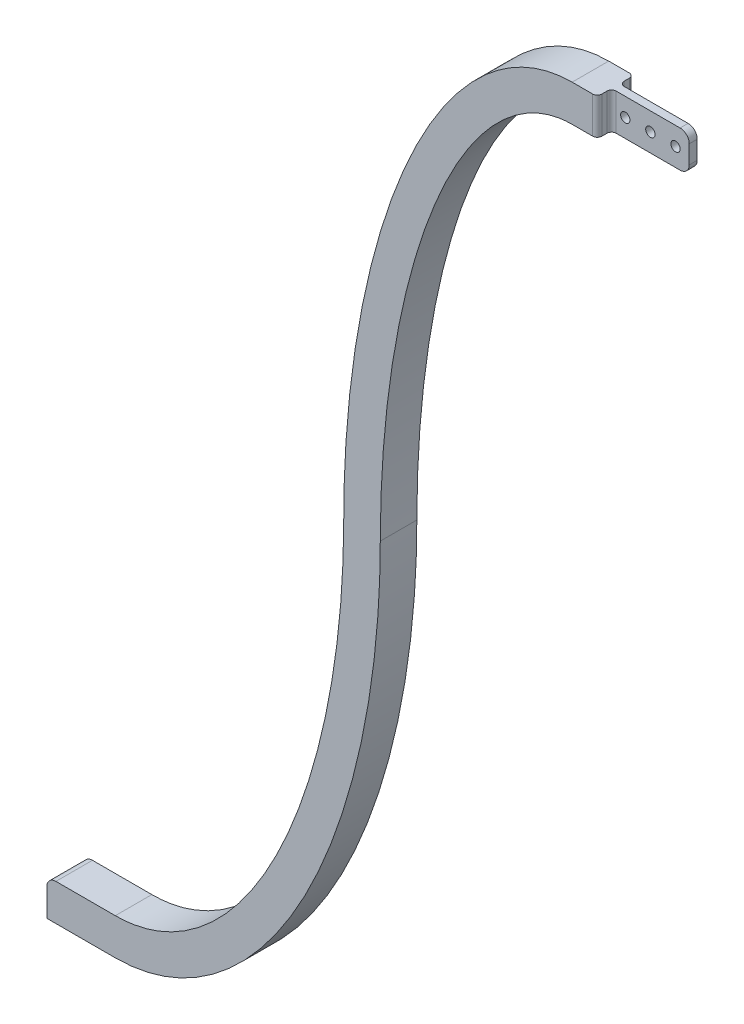
ISO-10303-21;
HEADER;
FILE_DESCRIPTION(('STEP AP214'),'2;1');
FILE_NAME('part.step','',(''),(''),'','','');
FILE_SCHEMA(('AUTOMOTIVE_DESIGN { 1 0 10303 214 1 1 1 1 }'));
ENDSEC;
DATA;
#1=APPLICATION_CONTEXT('core data for automotive mechanical design processes');
#2=APPLICATION_PROTOCOL_DEFINITION('international standard','automotive_design',2000,#1);
#3=PRODUCT_CONTEXT('',#1,'mechanical');
#4=PRODUCT('Part','Part','',(#3));
#5=PRODUCT_RELATED_PRODUCT_CATEGORY('part','',(#4));
#6=PRODUCT_DEFINITION_FORMATION('','',#4);
#7=PRODUCT_DEFINITION_CONTEXT('part definition',#1,'design');
#8=PRODUCT_DEFINITION('design','',#6,#7);
#9=PRODUCT_DEFINITION_SHAPE('','',#8);
#10=(LENGTH_UNIT() NAMED_UNIT(*) SI_UNIT(.MILLI.,.METRE.));
#11=(NAMED_UNIT(*) PLANE_ANGLE_UNIT() SI_UNIT($,.RADIAN.));
#12=(NAMED_UNIT(*) SI_UNIT($,.STERADIAN.) SOLID_ANGLE_UNIT());
#13=UNCERTAINTY_MEASURE_WITH_UNIT(LENGTH_MEASURE(1.E-05),#10,'distance_accuracy_value','');
#14=(GEOMETRIC_REPRESENTATION_CONTEXT(3) GLOBAL_UNCERTAINTY_ASSIGNED_CONTEXT((#13)) GLOBAL_UNIT_ASSIGNED_CONTEXT((#10,
#11,#12)) REPRESENTATION_CONTEXT('',''));
#15=CARTESIAN_POINT('',(0.,0.,0.));
#16=DIRECTION('',(0.,0.,1.));
#17=DIRECTION('',(1.,0.,0.));
#18=AXIS2_PLACEMENT_3D('',#15,#16,#17);
#19=CARTESIAN_POINT('',(72.5,108.,4.));
#20=DIRECTION('',(-1.,0.,0.));
#21=DIRECTION('',(0.,0.,1.));
#22=AXIS2_PLACEMENT_3D('',#19,#20,#21);
#23=PLANE('',#22);
#24=DIRECTION('',(0.,1.,0.));
#25=VECTOR('',#24,1.);
#26=CARTESIAN_POINT('',(72.5,108.,-0.875));
#27=LINE('',#26,#25);
#28=CARTESIAN_POINT('',(72.5,102.,-0.875));
#29=VERTEX_POINT('',#28);
#30=CARTESIAN_POINT('',(72.5,106.,-0.875));
#31=VERTEX_POINT('',#30);
#32=EDGE_CURVE('E190',#29,#31,#27,.T.);
#33=ORIENTED_EDGE('',*,*,#32,.T.);
#34=DIRECTION('',(0.,0.,-1.));
#35=VECTOR('',#34,1.);
#36=CARTESIAN_POINT('',(72.5,106.,4.));
#37=LINE('',#36,#35);
#38=CARTESIAN_POINT('',(72.5,106.,0.875));
#39=VERTEX_POINT('',#38);
#40=EDGE_CURVE('E198',#31,#39,#37,.F.);
#41=ORIENTED_EDGE('',*,*,#40,.T.);
#42=DIRECTION('',(0.,1.,0.));
#43=VECTOR('',#42,1.);
#44=CARTESIAN_POINT('',(72.5,108.,0.875));
#45=LINE('',#44,#43);
#46=CARTESIAN_POINT('',(72.5,102.,0.875));
#47=VERTEX_POINT('',#46);
#48=EDGE_CURVE('E285',#47,#39,#45,.T.);
#49=ORIENTED_EDGE('',*,*,#48,.F.);
#50=DIRECTION('',(0.,0.,-1.));
#51=VECTOR('',#50,1.);
#52=CARTESIAN_POINT('',(72.5,102.,4.));
#53=LINE('',#52,#51);
#54=EDGE_CURVE('E215',#47,#29,#53,.T.);
#55=ORIENTED_EDGE('',*,*,#54,.T.);
#56=EDGE_LOOP('',(#33,#41,#49,#55));
#57=FACE_BOUND('',#56,.T.);
#58=ADVANCED_FACE('F39',(#57),#23,.F.);
#59=CARTESIAN_POINT('',(58.5,104.,-4.));
#60=DIRECTION('',(0.,0.,1.));
#61=DIRECTION('',(1.,0.,0.));
#62=AXIS2_PLACEMENT_3D('',#59,#60,#61);
#63=CYLINDRICAL_SURFACE('',#62,1.025);
#64=CARTESIAN_POINT('',(58.5,104.,0.875));
#65=DIRECTION('',(0.,0.,1.));
#66=DIRECTION('',(1.,0.,0.));
#67=AXIS2_PLACEMENT_3D('',#64,#65,#66);
#68=CIRCLE('',#67,1.025);
#69=CARTESIAN_POINT('',(59.525,104.,0.875));
#70=VERTEX_POINT('',#69);
#71=EDGE_CURVE('E305',#70,#70,#68,.F.);
#72=ORIENTED_EDGE('',*,*,#71,.F.);
#73=EDGE_LOOP('',(#72));
#74=FACE_BOUND('',#73,.T.);
#75=CARTESIAN_POINT('',(58.5,104.,-0.875));
#76=DIRECTION('',(0.,0.,-1.));
#77=DIRECTION('',(-1.,0.,0.));
#78=AXIS2_PLACEMENT_3D('',#75,#76,#77);
#79=CIRCLE('',#78,1.025);
#80=CARTESIAN_POINT('',(57.475,104.,-0.875));
#81=VERTEX_POINT('',#80);
#82=EDGE_CURVE('E390',#81,#81,#79,.F.);
#83=ORIENTED_EDGE('',*,*,#82,.F.);
#84=EDGE_LOOP('',(#83));
#85=FACE_BOUND('',#84,.T.);
#86=ADVANCED_FACE('F334',(#74,#85),#63,.F.);
#87=CARTESIAN_POINT('',(64.,104.,-4.));
#88=DIRECTION('',(0.,0.,1.));
#89=DIRECTION('',(1.,0.,0.));
#90=AXIS2_PLACEMENT_3D('',#87,#88,#89);
#91=CYLINDRICAL_SURFACE('',#90,1.025);
#92=CARTESIAN_POINT('',(64.,104.,0.875));
#93=DIRECTION('',(0.,0.,1.));
#94=DIRECTION('',(1.,0.,0.));
#95=AXIS2_PLACEMENT_3D('',#92,#93,#94);
#96=CIRCLE('',#95,1.025);
#97=CARTESIAN_POINT('',(65.025,104.,0.875));
#98=VERTEX_POINT('',#97);
#99=EDGE_CURVE('E301',#98,#98,#96,.F.);
#100=ORIENTED_EDGE('',*,*,#99,.F.);
#101=EDGE_LOOP('',(#100));
#102=FACE_BOUND('',#101,.T.);
#103=CARTESIAN_POINT('',(64.,104.,-0.875));
#104=DIRECTION('',(0.,0.,-1.));
#105=DIRECTION('',(-1.,0.,0.));
#106=AXIS2_PLACEMENT_3D('',#103,#104,#105);
#107=CIRCLE('',#106,1.025);
#108=CARTESIAN_POINT('',(62.975,104.,-0.875));
#109=VERTEX_POINT('',#108);
#110=EDGE_CURVE('E386',#109,#109,#107,.F.);
#111=ORIENTED_EDGE('',*,*,#110,.F.);
#112=EDGE_LOOP('',(#111));
#113=FACE_BOUND('',#112,.T.);
#114=ADVANCED_FACE('F398',(#102,#113),#91,.F.);
#115=CARTESIAN_POINT('',(69.5,104.,-4.));
#116=DIRECTION('',(0.,0.,1.));
#117=DIRECTION('',(1.,0.,0.));
#118=AXIS2_PLACEMENT_3D('',#115,#116,#117);
#119=CYLINDRICAL_SURFACE('',#118,1.025);
#120=CARTESIAN_POINT('',(69.5,104.,0.875));
#121=DIRECTION('',(0.,0.,1.));
#122=DIRECTION('',(1.,0.,0.));
#123=AXIS2_PLACEMENT_3D('',#120,#121,#122);
#124=CIRCLE('',#123,1.025);
#125=CARTESIAN_POINT('',(70.525,104.,0.875));
#126=VERTEX_POINT('',#125);
#127=EDGE_CURVE('E297',#126,#126,#124,.F.);
#128=ORIENTED_EDGE('',*,*,#127,.F.);
#129=EDGE_LOOP('',(#128));
#130=FACE_BOUND('',#129,.T.);
#131=CARTESIAN_POINT('',(69.5,104.,-0.875));
#132=DIRECTION('',(0.,0.,-1.));
#133=DIRECTION('',(-1.,0.,0.));
#134=AXIS2_PLACEMENT_3D('',#131,#132,#133);
#135=CIRCLE('',#134,1.025);
#136=CARTESIAN_POINT('',(68.475,104.,-0.875));
#137=VERTEX_POINT('',#136);
#138=EDGE_CURVE('E382',#137,#137,#135,.F.);
#139=ORIENTED_EDGE('',*,*,#138,.F.);
#140=EDGE_LOOP('',(#139));
#141=FACE_BOUND('',#140,.T.);
#142=ADVANCED_FACE('F344',(#130,#141),#119,.F.);
#143=CARTESIAN_POINT('',(70.5,102.,4.));
#144=DIRECTION('',(0.,0.,-1.));
#145=DIRECTION('',(-1.,0.,0.));
#146=AXIS2_PLACEMENT_3D('',#143,#144,#145);
#147=CYLINDRICAL_SURFACE('',#146,2.);
#148=DIRECTION('',(0.,0.,-1.));
#149=VECTOR('',#148,1.);
#150=CARTESIAN_POINT('',(70.5,100.,4.));
#151=LINE('',#150,#149);
#152=CARTESIAN_POINT('',(70.5,100.,-0.875));
#153=VERTEX_POINT('',#152);
#154=CARTESIAN_POINT('',(70.5,100.,0.875));
#155=VERTEX_POINT('',#154);
#156=EDGE_CURVE('E208',#153,#155,#151,.F.);
#157=ORIENTED_EDGE('',*,*,#156,.F.);
#158=CARTESIAN_POINT('',(70.5,102.,-0.875));
#159=DIRECTION('',(0.,0.,-1.));
#160=DIRECTION('',(-1.,0.,0.));
#161=AXIS2_PLACEMENT_3D('',#158,#159,#160);
#162=CIRCLE('',#161,2.);
#163=EDGE_CURVE('E200',#153,#29,#162,.F.);
#164=ORIENTED_EDGE('',*,*,#163,.T.);
#165=ORIENTED_EDGE('',*,*,#54,.F.);
#166=CARTESIAN_POINT('',(70.5,102.,0.875));
#167=DIRECTION('',(0.,0.,1.));
#168=DIRECTION('',(1.,0.,0.));
#169=AXIS2_PLACEMENT_3D('',#166,#167,#168);
#170=CIRCLE('',#169,2.);
#171=EDGE_CURVE('E292',#47,#155,#170,.F.);
#172=ORIENTED_EDGE('',*,*,#171,.T.);
#173=EDGE_LOOP('',(#157,#164,#165,#172));
#174=FACE_BOUND('',#173,.T.);
#175=ADVANCED_FACE('F341',(#174),#147,.T.);
#176=CARTESIAN_POINT('',(70.5,106.,4.));
#177=DIRECTION('',(0.,0.,-1.));
#178=DIRECTION('',(-1.,0.,0.));
#179=AXIS2_PLACEMENT_3D('',#176,#177,#178);
#180=CYLINDRICAL_SURFACE('',#179,2.);
#181=ORIENTED_EDGE('',*,*,#40,.F.);
#182=CARTESIAN_POINT('',(70.5,106.,-0.875));
#183=DIRECTION('',(0.,0.,-1.));
#184=DIRECTION('',(-1.,0.,0.));
#185=AXIS2_PLACEMENT_3D('',#182,#183,#184);
#186=CIRCLE('',#185,2.);
#187=CARTESIAN_POINT('',(70.5,108.,-0.875));
#188=VERTEX_POINT('',#187);
#189=EDGE_CURVE('E185',#31,#188,#186,.F.);
#190=ORIENTED_EDGE('',*,*,#189,.T.);
#191=DIRECTION('',(0.,0.,-1.));
#192=VECTOR('',#191,1.);
#193=CARTESIAN_POINT('',(70.5,108.,4.));
#194=LINE('',#193,#192);
#195=CARTESIAN_POINT('',(70.5,108.,0.875));
#196=VERTEX_POINT('',#195);
#197=EDGE_CURVE('E197',#196,#188,#194,.T.);
#198=ORIENTED_EDGE('',*,*,#197,.F.);
#199=CARTESIAN_POINT('',(70.5,106.,0.875));
#200=DIRECTION('',(0.,0.,1.));
#201=DIRECTION('',(1.,0.,0.));
#202=AXIS2_PLACEMENT_3D('',#199,#200,#201);
#203=CIRCLE('',#202,2.);
#204=EDGE_CURVE('E207',#196,#39,#203,.F.);
#205=ORIENTED_EDGE('',*,*,#204,.T.);
#206=EDGE_LOOP('',(#181,#190,#198,#205));
#207=FACE_BOUND('',#206,.T.);
#208=ADVANCED_FACE('F195',(#207),#180,.T.);
#209=CARTESIAN_POINT('',(50.,108.,4.));
#210=DIRECTION('',(0.,-1.,0.));
#211=DIRECTION('',(0.,0.,-1.));
#212=AXIS2_PLACEMENT_3D('',#209,#210,#211);
#213=PLANE('',#212);
#214=DIRECTION('',(-1.,0.,0.));
#215=VECTOR('',#214,1.);
#216=CARTESIAN_POINT('',(50.,108.,4.));
#217=LINE('',#216,#215);
#218=CARTESIAN_POINT('',(54.5,108.,4.));
#219=VERTEX_POINT('',#218);
#220=CARTESIAN_POINT('',(50.,108.,4.));
#221=VERTEX_POINT('',#220);
#222=EDGE_CURVE('E310',#219,#221,#217,.T.);
#223=ORIENTED_EDGE('',*,*,#222,.F.);
#224=CARTESIAN_POINT('',(54.5,108.,3.));
#225=DIRECTION('',(0.,-1.,0.));
#226=DIRECTION('',(0.,0.,-1.));
#227=AXIS2_PLACEMENT_3D('',#224,#225,#226);
#228=CIRCLE('',#227,1.);
#229=CARTESIAN_POINT('',(55.5,108.,3.));
#230=VERTEX_POINT('',#229);
#231=EDGE_CURVE('E237',#219,#230,#228,.F.);
#232=ORIENTED_EDGE('',*,*,#231,.T.);
#233=DIRECTION('',(0.,0.,1.));
#234=VECTOR('',#233,1.);
#235=CARTESIAN_POINT('',(55.5,108.,0.875));
#236=LINE('',#235,#234);
#237=CARTESIAN_POINT('',(55.5,108.,1.875));
#238=VERTEX_POINT('',#237);
#239=EDGE_CURVE('E278',#238,#230,#236,.T.);
#240=ORIENTED_EDGE('',*,*,#239,.F.);
#241=CARTESIAN_POINT('',(56.5,108.,1.875));
#242=DIRECTION('',(0.,-1.,0.));
#243=DIRECTION('',(0.,0.,-1.));
#244=AXIS2_PLACEMENT_3D('',#241,#242,#243);
#245=CIRCLE('',#244,1.);
#246=CARTESIAN_POINT('',(56.5,108.,0.875));
#247=VERTEX_POINT('',#246);
#248=EDGE_CURVE('E11',#238,#247,#245,.T.);
#249=ORIENTED_EDGE('',*,*,#248,.T.);
#250=DIRECTION('',(-1.,0.,0.));
#251=VECTOR('',#250,1.);
#252=CARTESIAN_POINT('',(55.5,108.,0.875));
#253=LINE('',#252,#251);
#254=EDGE_CURVE('E205',#196,#247,#253,.T.);
#255=ORIENTED_EDGE('',*,*,#254,.F.);
#256=ORIENTED_EDGE('',*,*,#197,.T.);
#257=DIRECTION('',(-1.,0.,0.));
#258=VECTOR('',#257,1.);
#259=CARTESIAN_POINT('',(55.5,108.,-0.875));
#260=LINE('',#259,#258);
#261=CARTESIAN_POINT('',(56.5,108.,-0.875));
#262=VERTEX_POINT('',#261);
#263=EDGE_CURVE('E181',#188,#262,#260,.T.);
#264=ORIENTED_EDGE('',*,*,#263,.T.);
#265=CARTESIAN_POINT('',(56.5,108.,-1.875));
#266=DIRECTION('',(0.,-1.,0.));
#267=DIRECTION('',(0.,0.,-1.));
#268=AXIS2_PLACEMENT_3D('',#265,#266,#267);
#269=CIRCLE('',#268,1.);
#270=CARTESIAN_POINT('',(55.5,108.,-1.875));
#271=VERTEX_POINT('',#270);
#272=EDGE_CURVE('E260',#262,#271,#269,.T.);
#273=ORIENTED_EDGE('',*,*,#272,.T.);
#274=DIRECTION('',(0.,0.,-1.));
#275=VECTOR('',#274,1.);
#276=CARTESIAN_POINT('',(55.5,108.,-0.875));
#277=LINE('',#276,#275);
#278=CARTESIAN_POINT('',(55.5,108.,-3.));
#279=VERTEX_POINT('',#278);
#280=EDGE_CURVE('E365',#271,#279,#277,.T.);
#281=ORIENTED_EDGE('',*,*,#280,.T.);
#282=CARTESIAN_POINT('',(54.5,108.,-3.));
#283=DIRECTION('',(0.,-1.,0.));
#284=DIRECTION('',(0.,0.,-1.));
#285=AXIS2_PLACEMENT_3D('',#282,#283,#284);
#286=CIRCLE('',#285,1.);
#287=CARTESIAN_POINT('',(54.5,108.,-4.));
#288=VERTEX_POINT('',#287);
#289=EDGE_CURVE('E234',#279,#288,#286,.F.);
#290=ORIENTED_EDGE('',*,*,#289,.T.);
#291=DIRECTION('',(-1.,0.,0.));
#292=VECTOR('',#291,1.);
#293=CARTESIAN_POINT('',(50.,108.,-4.));
#294=LINE('',#293,#292);
#295=CARTESIAN_POINT('',(50.,108.,-4.));
#296=VERTEX_POINT('',#295);
#297=EDGE_CURVE('E309',#288,#296,#294,.T.);
#298=ORIENTED_EDGE('',*,*,#297,.T.);
#299=DIRECTION('',(0.,0.,-1.));
#300=VECTOR('',#299,1.);
#301=CARTESIAN_POINT('',(50.,108.,4.));
#302=LINE('',#301,#300);
#303=EDGE_CURVE('E487',#221,#296,#302,.T.);
#304=ORIENTED_EDGE('',*,*,#303,.F.);
#305=EDGE_LOOP('',(#223,#232,#240,#249,#255,#256,#264,#273,#281,#290,#298,#304));
#306=FACE_BOUND('',#305,.T.);
#307=ADVANCED_FACE('F204',(#306),#213,.F.);
#308=CARTESIAN_POINT('',(50.,100.,4.));
#309=DIRECTION('',(0.,1.,0.));
#310=DIRECTION('',(0.,0.,1.));
#311=AXIS2_PLACEMENT_3D('',#308,#309,#310);
#312=PLANE('',#311);
#313=DIRECTION('',(0.,0.,1.));
#314=VECTOR('',#313,1.);
#315=CARTESIAN_POINT('',(55.5,100.,0.875));
#316=LINE('',#315,#314);
#317=CARTESIAN_POINT('',(55.5,100.,1.875));
#318=VERTEX_POINT('',#317);
#319=CARTESIAN_POINT('',(55.5,100.,3.));
#320=VERTEX_POINT('',#319);
#321=EDGE_CURVE('E268',#318,#320,#316,.T.);
#322=ORIENTED_EDGE('',*,*,#321,.T.);
#323=CARTESIAN_POINT('',(54.5,100.,3.));
#324=DIRECTION('',(0.,1.,0.));
#325=DIRECTION('',(0.,0.,1.));
#326=AXIS2_PLACEMENT_3D('',#323,#324,#325);
#327=CIRCLE('',#326,1.);
#328=CARTESIAN_POINT('',(54.5,100.,4.));
#329=VERTEX_POINT('',#328);
#330=EDGE_CURVE('E228',#320,#329,#327,.F.);
#331=ORIENTED_EDGE('',*,*,#330,.T.);
#332=DIRECTION('',(1.,0.,0.));
#333=VECTOR('',#332,1.);
#334=CARTESIAN_POINT('',(50.,100.,4.));
#335=LINE('',#334,#333);
#336=CARTESIAN_POINT('',(50.,100.,4.));
#337=VERTEX_POINT('',#336);
#338=EDGE_CURVE('E429',#337,#329,#335,.T.);
#339=ORIENTED_EDGE('',*,*,#338,.F.);
#340=DIRECTION('',(0.,0.,-1.));
#341=VECTOR('',#340,1.);
#342=CARTESIAN_POINT('',(50.,100.,4.));
#343=LINE('',#342,#341);
#344=CARTESIAN_POINT('',(50.,100.,-4.));
#345=VERTEX_POINT('',#344);
#346=EDGE_CURVE('E436',#337,#345,#343,.T.);
#347=ORIENTED_EDGE('',*,*,#346,.T.);
#348=DIRECTION('',(1.,0.,0.));
#349=VECTOR('',#348,1.);
#350=CARTESIAN_POINT('',(50.,100.,-4.));
#351=LINE('',#350,#349);
#352=CARTESIAN_POINT('',(54.5,100.,-4.));
#353=VERTEX_POINT('',#352);
#354=EDGE_CURVE('E314',#345,#353,#351,.T.);
#355=ORIENTED_EDGE('',*,*,#354,.T.);
#356=CARTESIAN_POINT('',(54.5,100.,-3.));
#357=DIRECTION('',(0.,1.,0.));
#358=DIRECTION('',(0.,0.,1.));
#359=AXIS2_PLACEMENT_3D('',#356,#357,#358);
#360=CIRCLE('',#359,1.);
#361=CARTESIAN_POINT('',(55.5,100.,-3.));
#362=VERTEX_POINT('',#361);
#363=EDGE_CURVE('E225',#353,#362,#360,.F.);
#364=ORIENTED_EDGE('',*,*,#363,.T.);
#365=DIRECTION('',(0.,0.,-1.));
#366=VECTOR('',#365,1.);
#367=CARTESIAN_POINT('',(55.5,100.,-0.875));
#368=LINE('',#367,#366);
#369=CARTESIAN_POINT('',(55.5,100.,-1.875));
#370=VERTEX_POINT('',#369);
#371=EDGE_CURVE('E201',#370,#362,#368,.T.);
#372=ORIENTED_EDGE('',*,*,#371,.F.);
#373=CARTESIAN_POINT('',(56.5,100.,-1.875));
#374=DIRECTION('',(0.,1.,0.));
#375=DIRECTION('',(0.,0.,1.));
#376=AXIS2_PLACEMENT_3D('',#373,#374,#375);
#377=CIRCLE('',#376,1.);
#378=CARTESIAN_POINT('',(56.5,100.,-0.875));
#379=VERTEX_POINT('',#378);
#380=EDGE_CURVE('E257',#370,#379,#377,.T.);
#381=ORIENTED_EDGE('',*,*,#380,.T.);
#382=DIRECTION('',(1.,0.,0.));
#383=VECTOR('',#382,1.);
#384=CARTESIAN_POINT('',(55.5,100.,-0.875));
#385=LINE('',#384,#383);
#386=EDGE_CURVE('E372',#379,#153,#385,.T.);
#387=ORIENTED_EDGE('',*,*,#386,.T.);
#388=ORIENTED_EDGE('',*,*,#156,.T.);
#389=DIRECTION('',(1.,0.,0.));
#390=VECTOR('',#389,1.);
#391=CARTESIAN_POINT('',(55.5,100.,0.875));
#392=LINE('',#391,#390);
#393=CARTESIAN_POINT('',(56.5,100.,0.875));
#394=VERTEX_POINT('',#393);
#395=EDGE_CURVE('E269',#394,#155,#392,.T.);
#396=ORIENTED_EDGE('',*,*,#395,.F.);
#397=CARTESIAN_POINT('',(56.5,100.,1.875));
#398=DIRECTION('',(0.,1.,0.));
#399=DIRECTION('',(0.,0.,1.));
#400=AXIS2_PLACEMENT_3D('',#397,#398,#399);
#401=CIRCLE('',#400,1.);
#402=EDGE_CURVE('E48',#394,#318,#401,.T.);
#403=ORIENTED_EDGE('',*,*,#402,.T.);
#404=EDGE_LOOP('',(#322,#331,#339,#347,#355,#364,#372,#381,#387,#388,#396,#403));
#405=FACE_BOUND('',#404,.T.);
#406=ADVANCED_FACE('F267',(#405),#312,.F.);
#407=CARTESIAN_POINT('',(50.,0.,-4.));
#408=DIRECTION('',(0.,0.,1.));
#409=DIRECTION('',(1.,0.,0.));
#410=AXIS2_PLACEMENT_3D('',#407,#408,#409);
#411=PLANE('',#410);
#412=ORIENTED_EDGE('',*,*,#297,.F.);
#413=DIRECTION('',(0.,-1.,0.));
#414=VECTOR('',#413,1.);
#415=CARTESIAN_POINT('',(54.5,100.,-4.));
#416=LINE('',#415,#414);
#417=EDGE_CURVE('E240',#288,#353,#416,.T.);
#418=ORIENTED_EDGE('',*,*,#417,.T.);
#419=ORIENTED_EDGE('',*,*,#354,.F.);
#420=CARTESIAN_POINT('',(50.,0.,-4.));
#421=DIRECTION('',(0.,0.,-1.));
#422=DIRECTION('',(0.,1.,0.));
#423=AXIS2_PLACEMENT_3D('',#420,#421,#422);
#424=ELLIPSE('',#423,100.,42.);
#425=CARTESIAN_POINT('',(8.,0.,-4.));
#426=VERTEX_POINT('',#425);
#427=EDGE_CURVE('E458',#426,#345,#424,.T.);
#428=ORIENTED_EDGE('',*,*,#427,.F.);
#429=CARTESIAN_POINT('',(-50.,0.,-4.));
#430=DIRECTION('',(0.,0.,1.));
#431=DIRECTION('',(0.,-1.,0.));
#432=AXIS2_PLACEMENT_3D('',#429,#430,#431);
#433=ELLIPSE('',#432,108.,58.);
#434=CARTESIAN_POINT('',(-50.,-108.,-4.));
#435=VERTEX_POINT('',#434);
#436=EDGE_CURVE('E455',#435,#426,#433,.T.);
#437=ORIENTED_EDGE('',*,*,#436,.F.);
#438=DIRECTION('',(1.,0.,0.));
#439=VECTOR('',#438,1.);
#440=CARTESIAN_POINT('',(-50.,-108.,-4.));
#441=LINE('',#440,#439);
#442=CARTESIAN_POINT('',(-65.,-108.,-4.));
#443=VERTEX_POINT('',#442);
#444=EDGE_CURVE('E452',#443,#435,#441,.T.);
#445=ORIENTED_EDGE('',*,*,#444,.F.);
#446=DIRECTION('',(0.,-1.,0.));
#447=VECTOR('',#446,1.);
#448=CARTESIAN_POINT('',(-65.,-100.,-4.));
#449=LINE('',#448,#447);
#450=CARTESIAN_POINT('',(-65.,-102.,-4.));
#451=VERTEX_POINT('',#450);
#452=EDGE_CURVE('E449',#451,#443,#449,.T.);
#453=ORIENTED_EDGE('',*,*,#452,.F.);
#454=CARTESIAN_POINT('',(-63.,-102.,-4.));
#455=DIRECTION('',(0.,0.,1.));
#456=DIRECTION('',(1.,0.,0.));
#457=AXIS2_PLACEMENT_3D('',#454,#455,#456);
#458=CIRCLE('',#457,2.);
#459=CARTESIAN_POINT('',(-63.,-100.,-4.));
#460=VERTEX_POINT('',#459);
#461=EDGE_CURVE('E495',#451,#460,#458,.F.);
#462=ORIENTED_EDGE('',*,*,#461,.T.);
#463=DIRECTION('',(-1.,0.,0.));
#464=VECTOR('',#463,1.);
#465=CARTESIAN_POINT('',(-50.,-100.,-4.));
#466=LINE('',#465,#464);
#467=CARTESIAN_POINT('',(-50.,-100.,-4.));
#468=VERTEX_POINT('',#467);
#469=EDGE_CURVE('E445',#468,#460,#466,.T.);
#470=ORIENTED_EDGE('',*,*,#469,.F.);
#471=CARTESIAN_POINT('',(-50.,0.,-4.));
#472=DIRECTION('',(0.,0.,-1.));
#473=DIRECTION('',(0.,1.,0.));
#474=AXIS2_PLACEMENT_3D('',#471,#472,#473);
#475=ELLIPSE('',#474,100.,50.);
#476=CARTESIAN_POINT('',(0.,0.,-4.));
#477=VERTEX_POINT('',#476);
#478=EDGE_CURVE('E442',#477,#468,#475,.T.);
#479=ORIENTED_EDGE('',*,*,#478,.F.);
#480=CARTESIAN_POINT('',(50.,0.,-4.));
#481=DIRECTION('',(0.,0.,1.));
#482=DIRECTION('',(0.,-1.,0.));
#483=AXIS2_PLACEMENT_3D('',#480,#481,#482);
#484=ELLIPSE('',#483,108.,50.);
#485=EDGE_CURVE('E439',#296,#477,#484,.T.);
#486=ORIENTED_EDGE('',*,*,#485,.F.);
#487=EDGE_LOOP('',(#412,#418,#419,#428,#437,#445,#453,#462,#470,#479,#486));
#488=FACE_BOUND('',#487,.T.);
#489=ADVANCED_FACE('F327',(#488),#411,.F.);
#490=CARTESIAN_POINT('',(50.,0.,4.));
#491=DIRECTION('',(0.,0.,1.));
#492=DIRECTION('',(0.,-1.,0.));
#493=AXIS2_PLACEMENT_3D('',#490,#491,#492);
#494=ELLIPSE('',#493,108.,50.);
#495=DIRECTION('',(0.,0.,-1.));
#496=VECTOR('',#495,1.);
#497=SURFACE_OF_LINEAR_EXTRUSION('',#494,#496);
#498=ORIENTED_EDGE('',*,*,#485,.T.);
#499=DIRECTION('',(0.,0.,-1.));
#500=VECTOR('',#499,1.);
#501=CARTESIAN_POINT('',(0.,0.,4.));
#502=LINE('',#501,#500);
#503=CARTESIAN_POINT('',(0.,0.,4.));
#504=VERTEX_POINT('',#503);
#505=EDGE_CURVE('E483',#504,#477,#502,.T.);
#506=ORIENTED_EDGE('',*,*,#505,.F.);
#507=EDGE_CURVE('E313',#221,#504,#494,.T.);
#508=ORIENTED_EDGE('',*,*,#507,.F.);
#509=ORIENTED_EDGE('',*,*,#303,.T.);
#510=EDGE_LOOP('',(#498,#506,#508,#509));
#511=FACE_BOUND('',#510,.T.);
#512=ADVANCED_FACE('F322',(#511),#497,.F.);
#513=CARTESIAN_POINT('',(-50.,0.,4.));
#514=DIRECTION('',(0.,0.,-1.));
#515=DIRECTION('',(0.,1.,0.));
#516=AXIS2_PLACEMENT_3D('',#513,#514,#515);
#517=ELLIPSE('',#516,100.,50.);
#518=DIRECTION('',(0.,0.,-1.));
#519=VECTOR('',#518,1.);
#520=SURFACE_OF_LINEAR_EXTRUSION('',#517,#519);
#521=ORIENTED_EDGE('',*,*,#478,.T.);
#522=DIRECTION('',(0.,0.,-1.));
#523=VECTOR('',#522,1.);
#524=CARTESIAN_POINT('',(-50.,-100.,4.));
#525=LINE('',#524,#523);
#526=CARTESIAN_POINT('',(-50.,-100.,4.));
#527=VERTEX_POINT('',#526);
#528=EDGE_CURVE('E479',#527,#468,#525,.T.);
#529=ORIENTED_EDGE('',*,*,#528,.F.);
#530=EDGE_CURVE('E318',#504,#527,#517,.T.);
#531=ORIENTED_EDGE('',*,*,#530,.F.);
#532=ORIENTED_EDGE('',*,*,#505,.T.);
#533=EDGE_LOOP('',(#521,#529,#531,#532));
#534=FACE_BOUND('',#533,.T.);
#535=ADVANCED_FACE('F326',(#534),#520,.F.);
#536=CARTESIAN_POINT('',(-50.,-100.,4.));
#537=DIRECTION('',(0.,-1.,0.));
#538=DIRECTION('',(0.,0.,-1.));
#539=AXIS2_PLACEMENT_3D('',#536,#537,#538);
#540=PLANE('',#539);
#541=ORIENTED_EDGE('',*,*,#469,.T.);
#542=DIRECTION('',(0.,0.,-1.));
#543=VECTOR('',#542,1.);
#544=CARTESIAN_POINT('',(-63.,-100.,4.));
#545=LINE('',#544,#543);
#546=CARTESIAN_POINT('',(-63.,-100.,4.));
#547=VERTEX_POINT('',#546);
#548=EDGE_CURVE('E498',#460,#547,#545,.F.);
#549=ORIENTED_EDGE('',*,*,#548,.T.);
#550=DIRECTION('',(-1.,0.,0.));
#551=VECTOR('',#550,1.);
#552=CARTESIAN_POINT('',(-50.,-100.,4.));
#553=LINE('',#552,#551);
#554=EDGE_CURVE('E528',#527,#547,#553,.T.);
#555=ORIENTED_EDGE('',*,*,#554,.F.);
#556=ORIENTED_EDGE('',*,*,#528,.T.);
#557=EDGE_LOOP('',(#541,#549,#555,#556));
#558=FACE_BOUND('',#557,.T.);
#559=ADVANCED_FACE('F560',(#558),#540,.F.);
#560=CARTESIAN_POINT('',(-65.,-100.,4.));
#561=DIRECTION('',(1.,0.,0.));
#562=DIRECTION('',(0.,0.,-1.));
#563=AXIS2_PLACEMENT_3D('',#560,#561,#562);
#564=PLANE('',#563);
#565=DIRECTION('',(0.,-1.,0.));
#566=VECTOR('',#565,1.);
#567=CARTESIAN_POINT('',(-65.,-100.,4.));
#568=LINE('',#567,#566);
#569=CARTESIAN_POINT('',(-65.,-102.,4.));
#570=VERTEX_POINT('',#569);
#571=CARTESIAN_POINT('',(-65.,-108.,4.));
#572=VERTEX_POINT('',#571);
#573=EDGE_CURVE('E530',#570,#572,#568,.T.);
#574=ORIENTED_EDGE('',*,*,#573,.F.);
#575=DIRECTION('',(0.,0.,-1.));
#576=VECTOR('',#575,1.);
#577=CARTESIAN_POINT('',(-65.,-102.,4.));
#578=LINE('',#577,#576);
#579=EDGE_CURVE('E491',#570,#451,#578,.T.);
#580=ORIENTED_EDGE('',*,*,#579,.T.);
#581=ORIENTED_EDGE('',*,*,#452,.T.);
#582=DIRECTION('',(0.,0.,-1.));
#583=VECTOR('',#582,1.);
#584=CARTESIAN_POINT('',(-65.,-108.,4.));
#585=LINE('',#584,#583);
#586=EDGE_CURVE('E475',#572,#443,#585,.T.);
#587=ORIENTED_EDGE('',*,*,#586,.F.);
#588=EDGE_LOOP('',(#574,#580,#581,#587));
#589=FACE_BOUND('',#588,.T.);
#590=ADVANCED_FACE('F556',(#589),#564,.F.);
#591=CARTESIAN_POINT('',(-50.,-108.,4.));
#592=DIRECTION('',(0.,1.,0.));
#593=DIRECTION('',(0.,0.,1.));
#594=AXIS2_PLACEMENT_3D('',#591,#592,#593);
#595=PLANE('',#594);
#596=ORIENTED_EDGE('',*,*,#444,.T.);
#597=DIRECTION('',(0.,0.,-1.));
#598=VECTOR('',#597,1.);
#599=CARTESIAN_POINT('',(-50.,-108.,4.));
#600=LINE('',#599,#598);
#601=CARTESIAN_POINT('',(-50.,-108.,4.));
#602=VERTEX_POINT('',#601);
#603=EDGE_CURVE('E471',#602,#435,#600,.T.);
#604=ORIENTED_EDGE('',*,*,#603,.F.);
#605=DIRECTION('',(1.,0.,0.));
#606=VECTOR('',#605,1.);
#607=CARTESIAN_POINT('',(-50.,-108.,4.));
#608=LINE('',#607,#606);
#609=EDGE_CURVE('E533',#572,#602,#608,.T.);
#610=ORIENTED_EDGE('',*,*,#609,.F.);
#611=ORIENTED_EDGE('',*,*,#586,.T.);
#612=EDGE_LOOP('',(#596,#604,#610,#611));
#613=FACE_BOUND('',#612,.T.);
#614=ADVANCED_FACE('F552',(#613),#595,.F.);
#615=CARTESIAN_POINT('',(-50.,0.,4.));
#616=DIRECTION('',(0.,0.,1.));
#617=DIRECTION('',(0.,-1.,0.));
#618=AXIS2_PLACEMENT_3D('',#615,#616,#617);
#619=ELLIPSE('',#618,108.,58.);
#620=DIRECTION('',(0.,0.,-1.));
#621=VECTOR('',#620,1.);
#622=SURFACE_OF_LINEAR_EXTRUSION('',#619,#621);
#623=ORIENTED_EDGE('',*,*,#436,.T.);
#624=DIRECTION('',(0.,0.,-1.));
#625=VECTOR('',#624,1.);
#626=CARTESIAN_POINT('',(8.,0.,4.));
#627=LINE('',#626,#625);
#628=CARTESIAN_POINT('',(8.,0.,4.));
#629=VERTEX_POINT('',#628);
#630=EDGE_CURVE('E467',#629,#426,#627,.T.);
#631=ORIENTED_EDGE('',*,*,#630,.F.);
#632=EDGE_CURVE('E430',#602,#629,#619,.T.);
#633=ORIENTED_EDGE('',*,*,#632,.F.);
#634=ORIENTED_EDGE('',*,*,#603,.T.);
#635=EDGE_LOOP('',(#623,#631,#633,#634));
#636=FACE_BOUND('',#635,.T.);
#637=ADVANCED_FACE('F421',(#636),#622,.F.);
#638=CARTESIAN_POINT('',(50.,0.,4.));
#639=DIRECTION('',(0.,0.,-1.));
#640=DIRECTION('',(0.,1.,0.));
#641=AXIS2_PLACEMENT_3D('',#638,#639,#640);
#642=ELLIPSE('',#641,100.,42.);
#643=DIRECTION('',(0.,0.,-1.));
#644=VECTOR('',#643,1.);
#645=SURFACE_OF_LINEAR_EXTRUSION('',#642,#644);
#646=ORIENTED_EDGE('',*,*,#427,.T.);
#647=ORIENTED_EDGE('',*,*,#346,.F.);
#648=EDGE_CURVE('E425',#629,#337,#642,.T.);
#649=ORIENTED_EDGE('',*,*,#648,.F.);
#650=ORIENTED_EDGE('',*,*,#630,.T.);
#651=EDGE_LOOP('',(#646,#647,#649,#650));
#652=FACE_BOUND('',#651,.T.);
#653=ADVANCED_FACE('F411',(#652),#645,.F.);
#654=CARTESIAN_POINT('',(50.,0.,4.));
#655=DIRECTION('',(0.,0.,1.));
#656=DIRECTION('',(1.,0.,0.));
#657=AXIS2_PLACEMENT_3D('',#654,#655,#656);
#658=PLANE('',#657);
#659=ORIENTED_EDGE('',*,*,#338,.T.);
#660=DIRECTION('',(0.,-1.,0.));
#661=VECTOR('',#660,1.);
#662=CARTESIAN_POINT('',(54.5,108.,4.));
#663=LINE('',#662,#661);
#664=EDGE_CURVE('E231',#329,#219,#663,.F.);
#665=ORIENTED_EDGE('',*,*,#664,.T.);
#666=ORIENTED_EDGE('',*,*,#222,.T.);
#667=ORIENTED_EDGE('',*,*,#507,.T.);
#668=ORIENTED_EDGE('',*,*,#530,.T.);
#669=ORIENTED_EDGE('',*,*,#554,.T.);
#670=CARTESIAN_POINT('',(-63.,-102.,4.));
#671=DIRECTION('',(0.,0.,1.));
#672=DIRECTION('',(1.,0.,0.));
#673=AXIS2_PLACEMENT_3D('',#670,#671,#672);
#674=CIRCLE('',#673,2.);
#675=EDGE_CURVE('E501',#547,#570,#674,.T.);
#676=ORIENTED_EDGE('',*,*,#675,.T.);
#677=ORIENTED_EDGE('',*,*,#573,.T.);
#678=ORIENTED_EDGE('',*,*,#609,.T.);
#679=ORIENTED_EDGE('',*,*,#632,.T.);
#680=ORIENTED_EDGE('',*,*,#648,.T.);
#681=EDGE_LOOP('',(#659,#665,#666,#667,#668,#669,#676,#677,#678,#679,#680));
#682=FACE_BOUND('',#681,.T.);
#683=ADVANCED_FACE('F339',(#682),#658,.T.);
#684=CARTESIAN_POINT('',(-63.,-102.,4.));
#685=DIRECTION('',(0.,0.,-1.));
#686=DIRECTION('',(-1.,0.,0.));
#687=AXIS2_PLACEMENT_3D('',#684,#685,#686);
#688=CYLINDRICAL_SURFACE('',#687,2.);
#689=ORIENTED_EDGE('',*,*,#675,.F.);
#690=ORIENTED_EDGE('',*,*,#548,.F.);
#691=ORIENTED_EDGE('',*,*,#461,.F.);
#692=ORIENTED_EDGE('',*,*,#579,.F.);
#693=EDGE_LOOP('',(#689,#690,#691,#692));
#694=FACE_BOUND('',#693,.T.);
#695=ADVANCED_FACE('F336',(#694),#688,.T.);
#696=CARTESIAN_POINT('',(0.,0.,0.875));
#697=DIRECTION('',(0.,0.,1.));
#698=DIRECTION('',(1.,0.,0.));
#699=AXIS2_PLACEMENT_3D('',#696,#697,#698);
#700=PLANE('',#699);
#701=ORIENTED_EDGE('',*,*,#254,.T.);
#702=DIRECTION('',(0.,-1.,0.));
#703=VECTOR('',#702,1.);
#704=CARTESIAN_POINT('',(56.5,0.,0.875));
#705=LINE('',#704,#703);
#706=EDGE_CURVE('E253',#247,#394,#705,.T.);
#707=ORIENTED_EDGE('',*,*,#706,.T.);
#708=ORIENTED_EDGE('',*,*,#395,.T.);
#709=ORIENTED_EDGE('',*,*,#171,.F.);
#710=ORIENTED_EDGE('',*,*,#48,.T.);
#711=ORIENTED_EDGE('',*,*,#204,.F.);
#712=EDGE_LOOP('',(#701,#707,#708,#709,#710,#711));
#713=FACE_BOUND('',#712,.T.);
#714=ORIENTED_EDGE('',*,*,#127,.T.);
#715=EDGE_LOOP('',(#714));
#716=FACE_BOUND('',#715,.T.);
#717=ORIENTED_EDGE('',*,*,#99,.T.);
#718=EDGE_LOOP('',(#717));
#719=FACE_BOUND('',#718,.T.);
#720=ORIENTED_EDGE('',*,*,#71,.T.);
#721=EDGE_LOOP('',(#720));
#722=FACE_BOUND('',#721,.T.);
#723=ADVANCED_FACE('F281',(#713,#716,#719,#722),#700,.T.);
#724=CARTESIAN_POINT('',(55.5,108.,0.875));
#725=DIRECTION('',(-1.,0.,0.));
#726=DIRECTION('',(0.,0.,1.));
#727=AXIS2_PLACEMENT_3D('',#724,#725,#726);
#728=PLANE('',#727);
#729=ORIENTED_EDGE('',*,*,#239,.T.);
#730=DIRECTION('',(0.,-1.,0.));
#731=VECTOR('',#730,1.);
#732=CARTESIAN_POINT('',(55.5,100.,3.));
#733=LINE('',#732,#731);
#734=EDGE_CURVE('E221',#230,#320,#733,.T.);
#735=ORIENTED_EDGE('',*,*,#734,.T.);
#736=ORIENTED_EDGE('',*,*,#321,.F.);
#737=DIRECTION('',(0.,-1.,0.));
#738=VECTOR('',#737,1.);
#739=CARTESIAN_POINT('',(55.5,108.,1.875));
#740=LINE('',#739,#738);
#741=EDGE_CURVE('E212',#318,#238,#740,.F.);
#742=ORIENTED_EDGE('',*,*,#741,.T.);
#743=EDGE_LOOP('',(#729,#735,#736,#742));
#744=FACE_BOUND('',#743,.T.);
#745=ADVANCED_FACE('F275',(#744),#728,.F.);
#746=CARTESIAN_POINT('',(0.,0.,-0.875));
#747=DIRECTION('',(0.,0.,-1.));
#748=DIRECTION('',(1.,0.,0.));
#749=AXIS2_PLACEMENT_3D('',#746,#747,#748);
#750=PLANE('',#749);
#751=ORIENTED_EDGE('',*,*,#386,.F.);
#752=DIRECTION('',(0.,-1.,0.));
#753=VECTOR('',#752,1.);
#754=CARTESIAN_POINT('',(56.5,108.,-0.875));
#755=LINE('',#754,#753);
#756=EDGE_CURVE('E55',#379,#262,#755,.F.);
#757=ORIENTED_EDGE('',*,*,#756,.T.);
#758=ORIENTED_EDGE('',*,*,#263,.F.);
#759=ORIENTED_EDGE('',*,*,#189,.F.);
#760=ORIENTED_EDGE('',*,*,#32,.F.);
#761=ORIENTED_EDGE('',*,*,#163,.F.);
#762=EDGE_LOOP('',(#751,#757,#758,#759,#760,#761));
#763=FACE_BOUND('',#762,.T.);
#764=ORIENTED_EDGE('',*,*,#138,.T.);
#765=EDGE_LOOP('',(#764));
#766=FACE_BOUND('',#765,.T.);
#767=ORIENTED_EDGE('',*,*,#110,.T.);
#768=EDGE_LOOP('',(#767));
#769=FACE_BOUND('',#768,.T.);
#770=ORIENTED_EDGE('',*,*,#82,.T.);
#771=EDGE_LOOP('',(#770));
#772=FACE_BOUND('',#771,.T.);
#773=ADVANCED_FACE('F183',(#763,#766,#769,#772),#750,.T.);
#774=CARTESIAN_POINT('',(55.5,108.,-0.875));
#775=DIRECTION('',(1.,0.,0.));
#776=DIRECTION('',(0.,0.,-1.));
#777=AXIS2_PLACEMENT_3D('',#774,#775,#776);
#778=PLANE('',#777);
#779=ORIENTED_EDGE('',*,*,#371,.T.);
#780=DIRECTION('',(0.,-1.,0.));
#781=VECTOR('',#780,1.);
#782=CARTESIAN_POINT('',(55.5,108.,-3.));
#783=LINE('',#782,#781);
#784=EDGE_CURVE('E248',#362,#279,#783,.F.);
#785=ORIENTED_EDGE('',*,*,#784,.T.);
#786=ORIENTED_EDGE('',*,*,#280,.F.);
#787=DIRECTION('',(0.,-1.,0.));
#788=VECTOR('',#787,1.);
#789=CARTESIAN_POINT('',(55.5,100.,-1.875));
#790=LINE('',#789,#788);
#791=EDGE_CURVE('E244',#271,#370,#790,.T.);
#792=ORIENTED_EDGE('',*,*,#791,.T.);
#793=EDGE_LOOP('',(#779,#785,#786,#792));
#794=FACE_BOUND('',#793,.T.);
#795=ADVANCED_FACE('F352',(#794),#778,.T.);
#796=CARTESIAN_POINT('',(54.5,108.,3.));
#797=DIRECTION('',(0.,1.,0.));
#798=DIRECTION('',(0.,0.,1.));
#799=AXIS2_PLACEMENT_3D('',#796,#797,#798);
#800=CYLINDRICAL_SURFACE('',#799,1.);
#801=ORIENTED_EDGE('',*,*,#231,.F.);
#802=ORIENTED_EDGE('',*,*,#664,.F.);
#803=ORIENTED_EDGE('',*,*,#330,.F.);
#804=ORIENTED_EDGE('',*,*,#734,.F.);
#805=EDGE_LOOP('',(#801,#802,#803,#804));
#806=FACE_BOUND('',#805,.T.);
#807=ADVANCED_FACE('F348',(#806),#800,.T.);
#808=CARTESIAN_POINT('',(54.5,0.,-3.));
#809=DIRECTION('',(0.,1.,0.));
#810=DIRECTION('',(0.,0.,1.));
#811=AXIS2_PLACEMENT_3D('',#808,#809,#810);
#812=CYLINDRICAL_SURFACE('',#811,1.);
#813=ORIENTED_EDGE('',*,*,#289,.F.);
#814=ORIENTED_EDGE('',*,*,#784,.F.);
#815=ORIENTED_EDGE('',*,*,#363,.F.);
#816=ORIENTED_EDGE('',*,*,#417,.F.);
#817=EDGE_LOOP('',(#813,#814,#815,#816));
#818=FACE_BOUND('',#817,.T.);
#819=ADVANCED_FACE('F351',(#818),#812,.T.);
#820=CARTESIAN_POINT('',(56.5,108.,-1.875));
#821=DIRECTION('',(0.,1.,0.));
#822=DIRECTION('',(0.,0.,1.));
#823=AXIS2_PLACEMENT_3D('',#820,#821,#822);
#824=CYLINDRICAL_SURFACE('',#823,1.);
#825=ORIENTED_EDGE('',*,*,#272,.F.);
#826=ORIENTED_EDGE('',*,*,#756,.F.);
#827=ORIENTED_EDGE('',*,*,#380,.F.);
#828=ORIENTED_EDGE('',*,*,#791,.F.);
#829=EDGE_LOOP('',(#825,#826,#827,#828));
#830=FACE_BOUND('',#829,.T.);
#831=ADVANCED_FACE('F355',(#830),#824,.F.);
#832=CARTESIAN_POINT('',(56.5,0.,1.875));
#833=DIRECTION('',(0.,-1.,0.));
#834=DIRECTION('',(0.,0.,-1.));
#835=AXIS2_PLACEMENT_3D('',#832,#833,#834);
#836=CYLINDRICAL_SURFACE('',#835,1.);
#837=ORIENTED_EDGE('',*,*,#248,.F.);
#838=ORIENTED_EDGE('',*,*,#741,.F.);
#839=ORIENTED_EDGE('',*,*,#402,.F.);
#840=ORIENTED_EDGE('',*,*,#706,.F.);
#841=EDGE_LOOP('',(#837,#838,#839,#840));
#842=FACE_BOUND('',#841,.T.);
#843=ADVANCED_FACE('F41',(#842),#836,.F.);
#844=CLOSED_SHELL('',(#58,#86,#114,#142,#175,#208,#307,#406,#489,#512,#535,#559,#590,#614,#637,
#653,#683,#695,#723,#745,#773,#795,#807,#819,#831,#843));
#845=MANIFOLD_SOLID_BREP('B2',#844);
#846=ADVANCED_BREP_SHAPE_REPRESENTATION('',(#18,#845),#14);
#847=SHAPE_DEFINITION_REPRESENTATION(#9,#846);
ENDSEC;
END-ISO-10303-21;
